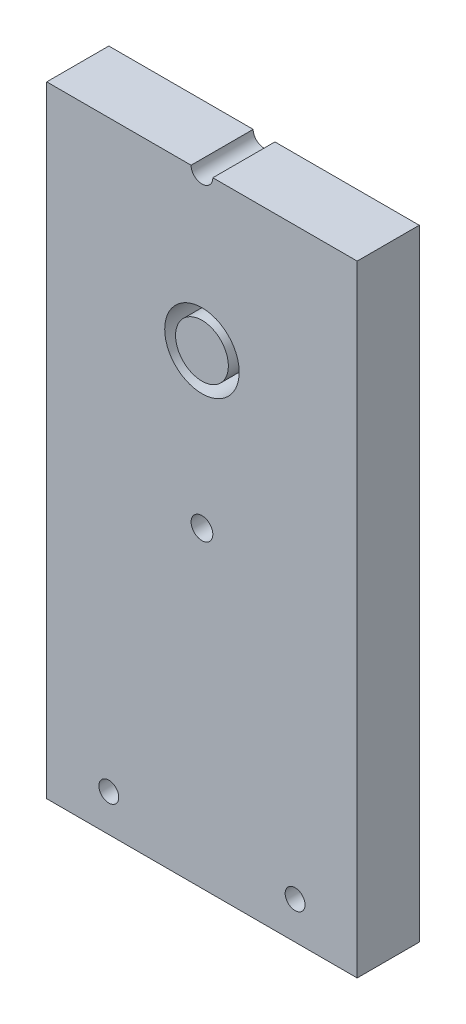
ISO-10303-21;
HEADER;
FILE_DESCRIPTION(('STEP AP214'),'2;1');
FILE_NAME('part.step','',(''),(''),'','','');
FILE_SCHEMA(('AUTOMOTIVE_DESIGN { 1 0 10303 214 1 1 1 1 }'));
ENDSEC;
DATA;
#1=APPLICATION_CONTEXT('core data for automotive mechanical design processes');
#2=APPLICATION_PROTOCOL_DEFINITION('international standard','automotive_design',2000,#1);
#3=PRODUCT_CONTEXT('',#1,'mechanical');
#4=PRODUCT('Part','Part','',(#3));
#5=PRODUCT_RELATED_PRODUCT_CATEGORY('part','',(#4));
#6=PRODUCT_DEFINITION_FORMATION('','',#4);
#7=PRODUCT_DEFINITION_CONTEXT('part definition',#1,'design');
#8=PRODUCT_DEFINITION('design','',#6,#7);
#9=PRODUCT_DEFINITION_SHAPE('','',#8);
#10=(LENGTH_UNIT() NAMED_UNIT(*) SI_UNIT(.MILLI.,.METRE.));
#11=(NAMED_UNIT(*) PLANE_ANGLE_UNIT() SI_UNIT($,.RADIAN.));
#12=(NAMED_UNIT(*) SI_UNIT($,.STERADIAN.) SOLID_ANGLE_UNIT());
#13=UNCERTAINTY_MEASURE_WITH_UNIT(LENGTH_MEASURE(1.E-05),#10,'distance_accuracy_value','');
#14=(GEOMETRIC_REPRESENTATION_CONTEXT(3) GLOBAL_UNCERTAINTY_ASSIGNED_CONTEXT((#13)) GLOBAL_UNIT_ASSIGNED_CONTEXT((#10,
#11,#12)) REPRESENTATION_CONTEXT('',''));
#15=CARTESIAN_POINT('',(0.,0.,0.));
#16=DIRECTION('',(0.,0.,1.));
#17=DIRECTION('',(1.,0.,0.));
#18=AXIS2_PLACEMENT_3D('',#15,#16,#17);
#19=CARTESIAN_POINT('',(-25.,100.,10.));
#20=DIRECTION('',(0.,-1.,0.));
#21=DIRECTION('',(0.,0.,-1.));
#22=AXIS2_PLACEMENT_3D('',#19,#20,#21);
#23=PLANE('',#22);
#24=DIRECTION('',(0.,0.,-1.));
#25=VECTOR('',#24,1.);
#26=CARTESIAN_POINT('',(-1.75,100.,11.));
#27=LINE('',#26,#25);
#28=CARTESIAN_POINT('',(-1.75,100.,0.));
#29=VERTEX_POINT('',#28);
#30=CARTESIAN_POINT('',(-1.75,100.,10.));
#31=VERTEX_POINT('',#30);
#32=EDGE_CURVE('E101',#29,#31,#27,.F.);
#33=ORIENTED_EDGE('',*,*,#32,.F.);
#34=DIRECTION('',(-1.,0.,0.));
#35=VECTOR('',#34,1.);
#36=CARTESIAN_POINT('',(-25.,100.,0.));
#37=LINE('',#36,#35);
#38=CARTESIAN_POINT('',(-25.,100.,0.));
#39=VERTEX_POINT('',#38);
#40=EDGE_CURVE('E311',#29,#39,#37,.T.);
#41=ORIENTED_EDGE('',*,*,#40,.T.);
#42=DIRECTION('',(0.,0.,-1.));
#43=VECTOR('',#42,1.);
#44=CARTESIAN_POINT('',(-25.,100.,10.));
#45=LINE('',#44,#43);
#46=CARTESIAN_POINT('',(-25.,100.,10.));
#47=VERTEX_POINT('',#46);
#48=EDGE_CURVE('E121',#47,#39,#45,.T.);
#49=ORIENTED_EDGE('',*,*,#48,.F.);
#50=DIRECTION('',(-1.,0.,0.));
#51=VECTOR('',#50,1.);
#52=CARTESIAN_POINT('',(-25.,100.,10.));
#53=LINE('',#52,#51);
#54=EDGE_CURVE('E113',#31,#47,#53,.T.);
#55=ORIENTED_EDGE('',*,*,#54,.F.);
#56=EDGE_LOOP('',(#33,#41,#49,#55));
#57=FACE_BOUND('',#56,.T.);
#58=ADVANCED_FACE('F52',(#57),#23,.F.);
#59=DIRECTION('',(0.,0.,-1.));
#60=VECTOR('',#59,1.);
#61=CARTESIAN_POINT('',(1.75,100.,11.));
#62=LINE('',#61,#60);
#63=CARTESIAN_POINT('',(1.75,100.,10.));
#64=VERTEX_POINT('',#63);
#65=CARTESIAN_POINT('',(1.75,100.,0.));
#66=VERTEX_POINT('',#65);
#67=EDGE_CURVE('E12',#64,#66,#62,.T.);
#68=ORIENTED_EDGE('',*,*,#67,.F.);
#69=CARTESIAN_POINT('',(25.,100.,10.));
#70=VERTEX_POINT('',#69);
#71=EDGE_CURVE('E119',#70,#64,#53,.T.);
#72=ORIENTED_EDGE('',*,*,#71,.F.);
#73=DIRECTION('',(0.,0.,-1.));
#74=VECTOR('',#73,1.);
#75=CARTESIAN_POINT('',(25.,100.,10.));
#76=LINE('',#75,#74);
#77=CARTESIAN_POINT('',(25.,100.,0.));
#78=VERTEX_POINT('',#77);
#79=EDGE_CURVE('E313',#70,#78,#76,.T.);
#80=ORIENTED_EDGE('',*,*,#79,.T.);
#81=EDGE_CURVE('E302',#78,#66,#37,.T.);
#82=ORIENTED_EDGE('',*,*,#81,.T.);
#83=EDGE_LOOP('',(#68,#72,#80,#82));
#84=FACE_BOUND('',#83,.T.);
#85=ADVANCED_FACE('F203',(#84),#23,.F.);
#86=CARTESIAN_POINT('',(-25.,0.,10.));
#87=DIRECTION('',(1.,0.,0.));
#88=DIRECTION('',(0.,0.,-1.));
#89=AXIS2_PLACEMENT_3D('',#86,#87,#88);
#90=PLANE('',#89);
#91=DIRECTION('',(0.,-1.,0.));
#92=VECTOR('',#91,1.);
#93=CARTESIAN_POINT('',(-25.,0.,0.));
#94=LINE('',#93,#92);
#95=CARTESIAN_POINT('',(-25.,0.,0.));
#96=VERTEX_POINT('',#95);
#97=EDGE_CURVE('E298',#39,#96,#94,.T.);
#98=ORIENTED_EDGE('',*,*,#97,.T.);
#99=DIRECTION('',(0.,0.,-1.));
#100=VECTOR('',#99,1.);
#101=CARTESIAN_POINT('',(-25.,0.,10.));
#102=LINE('',#101,#100);
#103=CARTESIAN_POINT('',(-25.,0.,10.));
#104=VERTEX_POINT('',#103);
#105=EDGE_CURVE('E301',#104,#96,#102,.T.);
#106=ORIENTED_EDGE('',*,*,#105,.F.);
#107=DIRECTION('',(0.,-1.,0.));
#108=VECTOR('',#107,1.);
#109=CARTESIAN_POINT('',(-25.,0.,10.));
#110=LINE('',#109,#108);
#111=EDGE_CURVE('E122',#47,#104,#110,.T.);
#112=ORIENTED_EDGE('',*,*,#111,.F.);
#113=ORIENTED_EDGE('',*,*,#48,.T.);
#114=EDGE_LOOP('',(#98,#106,#112,#113));
#115=FACE_BOUND('',#114,.T.);
#116=ADVANCED_FACE('F206',(#115),#90,.F.);
#117=CARTESIAN_POINT('',(-25.,0.,10.));
#118=DIRECTION('',(0.,1.,0.));
#119=DIRECTION('',(0.,0.,1.));
#120=AXIS2_PLACEMENT_3D('',#117,#118,#119);
#121=PLANE('',#120);
#122=DIRECTION('',(1.,0.,0.));
#123=VECTOR('',#122,1.);
#124=CARTESIAN_POINT('',(-25.,0.,0.));
#125=LINE('',#124,#123);
#126=CARTESIAN_POINT('',(25.,0.,0.));
#127=VERTEX_POINT('',#126);
#128=EDGE_CURVE('E306',#96,#127,#125,.T.);
#129=ORIENTED_EDGE('',*,*,#128,.T.);
#130=DIRECTION('',(0.,0.,-1.));
#131=VECTOR('',#130,1.);
#132=CARTESIAN_POINT('',(25.,0.,10.));
#133=LINE('',#132,#131);
#134=CARTESIAN_POINT('',(25.,0.,10.));
#135=VERTEX_POINT('',#134);
#136=EDGE_CURVE('E127',#135,#127,#133,.T.);
#137=ORIENTED_EDGE('',*,*,#136,.F.);
#138=DIRECTION('',(1.,0.,0.));
#139=VECTOR('',#138,1.);
#140=CARTESIAN_POINT('',(-25.,0.,10.));
#141=LINE('',#140,#139);
#142=EDGE_CURVE('E128',#104,#135,#141,.T.);
#143=ORIENTED_EDGE('',*,*,#142,.F.);
#144=ORIENTED_EDGE('',*,*,#105,.T.);
#145=EDGE_LOOP('',(#129,#137,#143,#144));
#146=FACE_BOUND('',#145,.T.);
#147=ADVANCED_FACE('F192',(#146),#121,.F.);
#148=CARTESIAN_POINT('',(25.,0.,10.));
#149=DIRECTION('',(-1.,0.,0.));
#150=DIRECTION('',(0.,0.,1.));
#151=AXIS2_PLACEMENT_3D('',#148,#149,#150);
#152=PLANE('',#151);
#153=DIRECTION('',(0.,1.,0.));
#154=VECTOR('',#153,1.);
#155=CARTESIAN_POINT('',(25.,0.,0.));
#156=LINE('',#155,#154);
#157=EDGE_CURVE('E134',#127,#78,#156,.T.);
#158=ORIENTED_EDGE('',*,*,#157,.T.);
#159=ORIENTED_EDGE('',*,*,#79,.F.);
#160=DIRECTION('',(0.,1.,0.));
#161=VECTOR('',#160,1.);
#162=CARTESIAN_POINT('',(25.,0.,10.));
#163=LINE('',#162,#161);
#164=EDGE_CURVE('E140',#135,#70,#163,.T.);
#165=ORIENTED_EDGE('',*,*,#164,.F.);
#166=ORIENTED_EDGE('',*,*,#136,.T.);
#167=EDGE_LOOP('',(#158,#159,#165,#166));
#168=FACE_BOUND('',#167,.T.);
#169=ADVANCED_FACE('F189',(#168),#152,.F.);
#170=CARTESIAN_POINT('',(0.,0.,10.));
#171=DIRECTION('',(0.,0.,-1.));
#172=DIRECTION('',(-1.,0.,0.));
#173=AXIS2_PLACEMENT_3D('',#170,#171,#172);
#174=PLANE('',#173);
#175=CARTESIAN_POINT('',(15.,6.,10.));
#176=DIRECTION('',(0.,0.,-1.));
#177=DIRECTION('',(-1.,0.,0.));
#178=AXIS2_PLACEMENT_3D('',#175,#176,#177);
#179=CIRCLE('',#178,1.6);
#180=CARTESIAN_POINT('',(13.4,6.,10.));
#181=VERTEX_POINT('',#180);
#182=EDGE_CURVE('E108',#181,#181,#179,.F.);
#183=ORIENTED_EDGE('',*,*,#182,.F.);
#184=EDGE_LOOP('',(#183));
#185=FACE_BOUND('',#184,.T.);
#186=CARTESIAN_POINT('',(0.,75.,10.));
#187=DIRECTION('',(0.,0.,-1.));
#188=DIRECTION('',(-1.,0.,0.));
#189=AXIS2_PLACEMENT_3D('',#186,#187,#188);
#190=CIRCLE('',#189,6.);
#191=CARTESIAN_POINT('',(-6.,75.,10.));
#192=VERTEX_POINT('',#191);
#193=EDGE_CURVE('E151',#192,#192,#190,.F.);
#194=ORIENTED_EDGE('',*,*,#193,.F.);
#195=EDGE_LOOP('',(#194));
#196=FACE_BOUND('',#195,.T.);
#197=CARTESIAN_POINT('',(0.,50.25,10.));
#198=DIRECTION('',(0.,0.,-1.));
#199=DIRECTION('',(-1.,0.,0.));
#200=AXIS2_PLACEMENT_3D('',#197,#198,#199);
#201=CIRCLE('',#200,1.75);
#202=CARTESIAN_POINT('',(-1.75,50.25,10.));
#203=VERTEX_POINT('',#202);
#204=EDGE_CURVE('E154',#203,#203,#201,.F.);
#205=ORIENTED_EDGE('',*,*,#204,.F.);
#206=EDGE_LOOP('',(#205));
#207=FACE_BOUND('',#206,.T.);
#208=CARTESIAN_POINT('',(0.,100.,10.));
#209=DIRECTION('',(0.,0.,-1.));
#210=DIRECTION('',(-1.,0.,0.));
#211=AXIS2_PLACEMENT_3D('',#208,#209,#210);
#212=CIRCLE('',#211,1.75);
#213=EDGE_CURVE('E61',#31,#64,#212,.F.);
#214=ORIENTED_EDGE('',*,*,#213,.F.);
#215=ORIENTED_EDGE('',*,*,#54,.T.);
#216=ORIENTED_EDGE('',*,*,#111,.T.);
#217=ORIENTED_EDGE('',*,*,#142,.T.);
#218=ORIENTED_EDGE('',*,*,#164,.T.);
#219=ORIENTED_EDGE('',*,*,#71,.T.);
#220=EDGE_LOOP('',(#214,#215,#216,#217,#218,#219));
#221=FACE_BOUND('',#220,.T.);
#222=CARTESIAN_POINT('',(-15.,6.,10.));
#223=DIRECTION('',(0.,0.,-1.));
#224=DIRECTION('',(-1.,0.,0.));
#225=AXIS2_PLACEMENT_3D('',#222,#223,#224);
#226=CIRCLE('',#225,1.6);
#227=CARTESIAN_POINT('',(-16.6,6.,10.));
#228=VERTEX_POINT('',#227);
#229=EDGE_CURVE('E158',#228,#228,#226,.F.);
#230=ORIENTED_EDGE('',*,*,#229,.F.);
#231=EDGE_LOOP('',(#230));
#232=FACE_BOUND('',#231,.T.);
#233=ADVANCED_FACE('F54',(#185,#196,#207,#221,#232),#174,.F.);
#234=CARTESIAN_POINT('',(0.,0.,0.));
#235=DIRECTION('',(0.,0.,-1.));
#236=DIRECTION('',(-1.,0.,0.));
#237=AXIS2_PLACEMENT_3D('',#234,#235,#236);
#238=PLANE('',#237);
#239=CARTESIAN_POINT('',(15.,6.,0.));
#240=DIRECTION('',(0.,0.,1.));
#241=DIRECTION('',(1.,0.,0.));
#242=AXIS2_PLACEMENT_3D('',#239,#240,#241);
#243=CIRCLE('',#242,1.6);
#244=CARTESIAN_POINT('',(16.6,6.,0.));
#245=VERTEX_POINT('',#244);
#246=EDGE_CURVE('E60',#245,#245,#243,.T.);
#247=ORIENTED_EDGE('',*,*,#246,.T.);
#248=EDGE_LOOP('',(#247));
#249=FACE_BOUND('',#248,.T.);
#250=CARTESIAN_POINT('',(0.,75.,0.));
#251=DIRECTION('',(0.,0.,1.));
#252=DIRECTION('',(1.,0.,0.));
#253=AXIS2_PLACEMENT_3D('',#250,#251,#252);
#254=CIRCLE('',#253,6.);
#255=CARTESIAN_POINT('',(6.,75.,0.));
#256=VERTEX_POINT('',#255);
#257=EDGE_CURVE('E142',#256,#256,#254,.T.);
#258=ORIENTED_EDGE('',*,*,#257,.T.);
#259=EDGE_LOOP('',(#258));
#260=FACE_BOUND('',#259,.T.);
#261=CARTESIAN_POINT('',(0.,50.25,0.));
#262=DIRECTION('',(0.,0.,1.));
#263=DIRECTION('',(1.,0.,0.));
#264=AXIS2_PLACEMENT_3D('',#261,#262,#263);
#265=CIRCLE('',#264,1.75);
#266=CARTESIAN_POINT('',(1.75,50.25,0.));
#267=VERTEX_POINT('',#266);
#268=EDGE_CURVE('E166',#267,#267,#265,.T.);
#269=ORIENTED_EDGE('',*,*,#268,.T.);
#270=EDGE_LOOP('',(#269));
#271=FACE_BOUND('',#270,.T.);
#272=CARTESIAN_POINT('',(-15.,6.,0.));
#273=DIRECTION('',(0.,0.,1.));
#274=DIRECTION('',(1.,0.,0.));
#275=AXIS2_PLACEMENT_3D('',#272,#273,#274);
#276=CIRCLE('',#275,1.6);
#277=CARTESIAN_POINT('',(-13.4,6.,0.));
#278=VERTEX_POINT('',#277);
#279=EDGE_CURVE('E164',#278,#278,#276,.T.);
#280=ORIENTED_EDGE('',*,*,#279,.T.);
#281=EDGE_LOOP('',(#280));
#282=FACE_BOUND('',#281,.T.);
#283=ORIENTED_EDGE('',*,*,#40,.F.);
#284=CARTESIAN_POINT('',(0.,100.,0.));
#285=DIRECTION('',(0.,0.,1.));
#286=DIRECTION('',(1.,0.,0.));
#287=AXIS2_PLACEMENT_3D('',#284,#285,#286);
#288=CIRCLE('',#287,1.75);
#289=EDGE_CURVE('E67',#29,#66,#288,.T.);
#290=ORIENTED_EDGE('',*,*,#289,.T.);
#291=ORIENTED_EDGE('',*,*,#81,.F.);
#292=ORIENTED_EDGE('',*,*,#157,.F.);
#293=ORIENTED_EDGE('',*,*,#128,.F.);
#294=ORIENTED_EDGE('',*,*,#97,.F.);
#295=EDGE_LOOP('',(#283,#290,#291,#292,#293,#294));
#296=FACE_BOUND('',#295,.T.);
#297=ADVANCED_FACE('F179',(#249,#260,#271,#282,#296),#238,.T.);
#298=CARTESIAN_POINT('',(-15.,6.,11.));
#299=DIRECTION('',(0.,0.,-1.));
#300=DIRECTION('',(-1.,0.,0.));
#301=AXIS2_PLACEMENT_3D('',#298,#299,#300);
#302=CYLINDRICAL_SURFACE('',#301,1.6);
#303=ORIENTED_EDGE('',*,*,#279,.F.);
#304=EDGE_LOOP('',(#303));
#305=FACE_BOUND('',#304,.T.);
#306=ORIENTED_EDGE('',*,*,#229,.T.);
#307=EDGE_LOOP('',(#306));
#308=FACE_BOUND('',#307,.T.);
#309=ADVANCED_FACE('F181',(#305,#308),#302,.F.);
#310=CARTESIAN_POINT('',(0.,50.25,11.));
#311=DIRECTION('',(0.,0.,-1.));
#312=DIRECTION('',(-1.,0.,0.));
#313=AXIS2_PLACEMENT_3D('',#310,#311,#312);
#314=CYLINDRICAL_SURFACE('',#313,1.75);
#315=ORIENTED_EDGE('',*,*,#268,.F.);
#316=EDGE_LOOP('',(#315));
#317=FACE_BOUND('',#316,.T.);
#318=ORIENTED_EDGE('',*,*,#204,.T.);
#319=EDGE_LOOP('',(#318));
#320=FACE_BOUND('',#319,.T.);
#321=ADVANCED_FACE('F178',(#317,#320),#314,.F.);
#322=CARTESIAN_POINT('',(0.,75.,11.));
#323=DIRECTION('',(0.,0.,-1.));
#324=DIRECTION('',(-1.,0.,0.));
#325=AXIS2_PLACEMENT_3D('',#322,#323,#324);
#326=CYLINDRICAL_SURFACE('',#325,6.);
#327=ORIENTED_EDGE('',*,*,#257,.F.);
#328=EDGE_LOOP('',(#327));
#329=FACE_BOUND('',#328,.T.);
#330=ORIENTED_EDGE('',*,*,#193,.T.);
#331=EDGE_LOOP('',(#330));
#332=FACE_BOUND('',#331,.T.);
#333=ADVANCED_FACE('F185',(#329,#332),#326,.F.);
#334=CARTESIAN_POINT('',(15.,6.,11.));
#335=DIRECTION('',(0.,0.,-1.));
#336=DIRECTION('',(-1.,0.,0.));
#337=AXIS2_PLACEMENT_3D('',#334,#335,#336);
#338=CYLINDRICAL_SURFACE('',#337,1.6);
#339=ORIENTED_EDGE('',*,*,#246,.F.);
#340=EDGE_LOOP('',(#339));
#341=FACE_BOUND('',#340,.T.);
#342=ORIENTED_EDGE('',*,*,#182,.T.);
#343=EDGE_LOOP('',(#342));
#344=FACE_BOUND('',#343,.T.);
#345=ADVANCED_FACE('F215',(#341,#344),#338,.F.);
#346=CARTESIAN_POINT('',(0.,100.,11.));
#347=DIRECTION('',(0.,0.,-1.));
#348=DIRECTION('',(-1.,0.,0.));
#349=AXIS2_PLACEMENT_3D('',#346,#347,#348);
#350=CYLINDRICAL_SURFACE('',#349,1.75);
#351=ORIENTED_EDGE('',*,*,#32,.T.);
#352=ORIENTED_EDGE('',*,*,#213,.T.);
#353=ORIENTED_EDGE('',*,*,#67,.T.);
#354=ORIENTED_EDGE('',*,*,#289,.F.);
#355=EDGE_LOOP('',(#351,#352,#353,#354));
#356=FACE_BOUND('',#355,.T.);
#357=ADVANCED_FACE('F103',(#356),#350,.F.);
#358=CLOSED_SHELL('',(#58,#85,#116,#147,#169,#233,#297,#309,#321,#333,#345,#357));
#359=MANIFOLD_SOLID_BREP('B2',#358);
#360=CARTESIAN_POINT('',(0.,0.,0.));
#361=DIRECTION('',(0.,0.,-1.));
#362=DIRECTION('',(-1.,0.,0.));
#363=AXIS2_PLACEMENT_3D('',#360,#361,#362);
#364=PLANE('',#363);
#365=CARTESIAN_POINT('',(0.,75.,0.));
#366=DIRECTION('',(0.,0.,1.));
#367=DIRECTION('',(1.,0.,0.));
#368=AXIS2_PLACEMENT_3D('',#365,#366,#367);
#369=CIRCLE('',#368,4.25);
#370=CARTESIAN_POINT('',(4.25,75.,0.));
#371=VERTEX_POINT('',#370);
#372=EDGE_CURVE('E341',#371,#371,#369,.T.);
#373=ORIENTED_EDGE('',*,*,#372,.F.);
#374=EDGE_LOOP('',(#373));
#375=FACE_BOUND('',#374,.T.);
#376=ADVANCED_FACE('F337',(#375),#364,.T.);
#377=CARTESIAN_POINT('',(0.,75.,11.));
#378=DIRECTION('',(0.,0.,-1.));
#379=DIRECTION('',(-1.,0.,0.));
#380=AXIS2_PLACEMENT_3D('',#377,#378,#379);
#381=CYLINDRICAL_SURFACE('',#380,4.25);
#382=ORIENTED_EDGE('',*,*,#372,.T.);
#383=EDGE_LOOP('',(#382));
#384=FACE_BOUND('',#383,.T.);
#385=CARTESIAN_POINT('',(0.,75.,10.));
#386=DIRECTION('',(0.,0.,-1.));
#387=DIRECTION('',(-1.,0.,0.));
#388=AXIS2_PLACEMENT_3D('',#385,#386,#387);
#389=CIRCLE('',#388,4.25);
#390=CARTESIAN_POINT('',(-4.25,75.,10.));
#391=VERTEX_POINT('',#390);
#392=EDGE_CURVE('E55',#391,#391,#389,.F.);
#393=ORIENTED_EDGE('',*,*,#392,.F.);
#394=EDGE_LOOP('',(#393));
#395=FACE_BOUND('',#394,.T.);
#396=ADVANCED_FACE('F346',(#384,#395),#381,.T.);
#397=CARTESIAN_POINT('',(0.,0.,10.));
#398=DIRECTION('',(0.,0.,-1.));
#399=DIRECTION('',(-1.,0.,0.));
#400=AXIS2_PLACEMENT_3D('',#397,#398,#399);
#401=PLANE('',#400);
#402=ORIENTED_EDGE('',*,*,#392,.T.);
#403=EDGE_LOOP('',(#402));
#404=FACE_BOUND('',#403,.T.);
#405=ADVANCED_FACE('F353',(#404),#401,.F.);
#406=CLOSED_SHELL('',(#376,#396,#405));
#407=MANIFOLD_SOLID_BREP('B6',#406);
#408=ADVANCED_BREP_SHAPE_REPRESENTATION('',(#18,#359,#407),#14);
#409=SHAPE_DEFINITION_REPRESENTATION(#9,#408);
ENDSEC;
END-ISO-10303-21;
